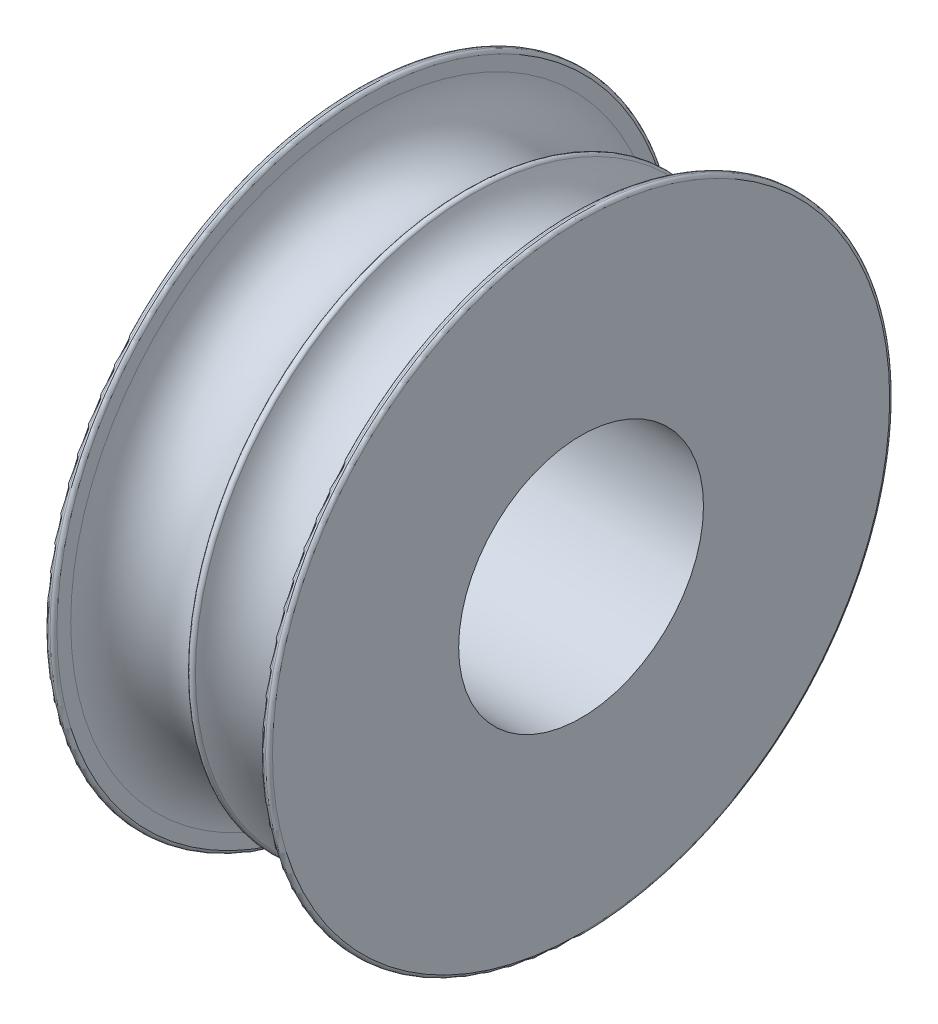
ISO-10303-21;
HEADER;
FILE_DESCRIPTION(('STEP AP214'),'2;1');
FILE_NAME('part.step','',(''),(''),'','','');
FILE_SCHEMA(('AUTOMOTIVE_DESIGN { 1 0 10303 214 1 1 1 1 }'));
ENDSEC;
DATA;
#1=APPLICATION_CONTEXT('core data for automotive mechanical design processes');
#2=APPLICATION_PROTOCOL_DEFINITION('international standard','automotive_design',2000,#1);
#3=PRODUCT_CONTEXT('',#1,'mechanical');
#4=PRODUCT('Part','Part','',(#3));
#5=PRODUCT_RELATED_PRODUCT_CATEGORY('part','',(#4));
#6=PRODUCT_DEFINITION_FORMATION('','',#4);
#7=PRODUCT_DEFINITION_CONTEXT('part definition',#1,'design');
#8=PRODUCT_DEFINITION('design','',#6,#7);
#9=PRODUCT_DEFINITION_SHAPE('','',#8);
#10=(LENGTH_UNIT() NAMED_UNIT(*) SI_UNIT(.MILLI.,.METRE.));
#11=(NAMED_UNIT(*) PLANE_ANGLE_UNIT() SI_UNIT($,.RADIAN.));
#12=(NAMED_UNIT(*) SI_UNIT($,.STERADIAN.) SOLID_ANGLE_UNIT());
#13=UNCERTAINTY_MEASURE_WITH_UNIT(LENGTH_MEASURE(1.E-05),#10,'distance_accuracy_value','');
#14=(GEOMETRIC_REPRESENTATION_CONTEXT(3) GLOBAL_UNCERTAINTY_ASSIGNED_CONTEXT((#13)) GLOBAL_UNIT_ASSIGNED_CONTEXT((#10,
#11,#12)) REPRESENTATION_CONTEXT('',''));
#15=CARTESIAN_POINT('',(0.,0.,0.));
#16=DIRECTION('',(0.,0.,1.));
#17=DIRECTION('',(1.,0.,0.));
#18=AXIS2_PLACEMENT_3D('',#15,#16,#17);
#19=CARTESIAN_POINT('',(0.,0.,0.));
#20=DIRECTION('',(-1.,0.,0.));
#21=DIRECTION('',(0.,0.,1.));
#22=AXIS2_PLACEMENT_3D('',#19,#20,#21);
#23=PLANE('',#22);
#24=CARTESIAN_POINT('',(0.,0.,0.));
#25=DIRECTION('',(-1.,0.,0.));
#26=DIRECTION('',(0.,0.,1.));
#27=AXIS2_PLACEMENT_3D('',#24,#25,#26);
#28=CIRCLE('',#27,17.9);
#29=CARTESIAN_POINT('',(0.,0.,17.9));
#30=VERTEX_POINT('',#29);
#31=EDGE_CURVE('E71',#30,#30,#28,.F.);
#32=ORIENTED_EDGE('',*,*,#31,.T.);
#33=EDGE_LOOP('',(#32));
#34=FACE_BOUND('',#33,.T.);
#35=CARTESIAN_POINT('',(0.,0.,0.));
#36=DIRECTION('',(-1.,0.,0.));
#37=DIRECTION('',(0.,0.,1.));
#38=AXIS2_PLACEMENT_3D('',#35,#36,#37);
#39=CIRCLE('',#38,7.1);
#40=CARTESIAN_POINT('',(0.,0.,7.1));
#41=VERTEX_POINT('',#40);
#42=EDGE_CURVE('E99',#41,#41,#39,.T.);
#43=ORIENTED_EDGE('',*,*,#42,.T.);
#44=EDGE_LOOP('',(#43));
#45=FACE_BOUND('',#44,.T.);
#46=ADVANCED_FACE('F43',(#34,#45),#23,.F.);
#47=CARTESIAN_POINT('',(-13.,0.,0.));
#48=DIRECTION('',(-1.,0.,0.));
#49=DIRECTION('',(0.,0.,1.));
#50=AXIS2_PLACEMENT_3D('',#47,#48,#49);
#51=CYLINDRICAL_SURFACE('',#50,18.1);
#52=CARTESIAN_POINT('',(-0.200000000000004,0.,0.));
#53=DIRECTION('',(-1.,0.,0.));
#54=DIRECTION('',(0.,0.,1.));
#55=AXIS2_PLACEMENT_3D('',#52,#53,#54);
#56=CIRCLE('',#55,18.1);
#57=CARTESIAN_POINT('',(-0.200000000000002,0.,18.1));
#58=VERTEX_POINT('',#57);
#59=EDGE_CURVE('E75',#58,#58,#56,.T.);
#60=ORIENTED_EDGE('',*,*,#59,.T.);
#61=EDGE_LOOP('',(#60));
#62=FACE_BOUND('',#61,.T.);
#63=CARTESIAN_POINT('',(-0.300000000000003,0.,0.));
#64=DIRECTION('',(1.,0.,0.));
#65=DIRECTION('',(0.,0.,-1.));
#66=AXIS2_PLACEMENT_3D('',#63,#64,#65);
#67=CIRCLE('',#66,18.1);
#68=CARTESIAN_POINT('',(-0.300000000000006,0.,-18.1));
#69=VERTEX_POINT('',#68);
#70=EDGE_CURVE('E79',#69,#69,#67,.T.);
#71=ORIENTED_EDGE('',*,*,#70,.T.);
#72=EDGE_LOOP('',(#71));
#73=FACE_BOUND('',#72,.T.);
#74=ADVANCED_FACE('F118',(#62,#73),#51,.T.);
#75=CARTESIAN_POINT('',(-0.500000000000004,0.,-18.1));
#76=DIRECTION('',(1.,0.,0.));
#77=DIRECTION('',(0.,0.,-1.));
#78=AXIS2_PLACEMENT_3D('',#75,#76,#77);
#79=PLANE('',#78);
#80=CARTESIAN_POINT('',(-0.500000000000002,0.,0.));
#81=DIRECTION('',(1.,0.,0.));
#82=DIRECTION('',(0.,0.,-1.));
#83=AXIS2_PLACEMENT_3D('',#80,#81,#82);
#84=CIRCLE('',#83,17.9);
#85=CARTESIAN_POINT('',(-0.500000000000004,0.,-17.9));
#86=VERTEX_POINT('',#85);
#87=EDGE_CURVE('E67',#86,#86,#84,.F.);
#88=ORIENTED_EDGE('',*,*,#87,.T.);
#89=EDGE_LOOP('',(#88));
#90=FACE_BOUND('',#89,.T.);
#91=CARTESIAN_POINT('',(-0.500000000000002,0.,0.));
#92=DIRECTION('',(-1.,0.,0.));
#93=DIRECTION('',(0.,0.,1.));
#94=AXIS2_PLACEMENT_3D('',#91,#92,#93);
#95=CIRCLE('',#94,17.1);
#96=CARTESIAN_POINT('',(-0.5,0.,17.1));
#97=VERTEX_POINT('',#96);
#98=EDGE_CURVE('E91',#97,#97,#95,.T.);
#99=ORIENTED_EDGE('',*,*,#98,.F.);
#100=EDGE_LOOP('',(#99));
#101=FACE_BOUND('',#100,.T.);
#102=ADVANCED_FACE('F124',(#90,#101),#79,.F.);
#103=CARTESIAN_POINT('',(-3.5,0.,0.));
#104=DIRECTION('',(-1.,0.,0.));
#105=DIRECTION('',(0.,0.,1.));
#106=AXIS2_PLACEMENT_3D('',#103,#104,#105);
#107=TOROIDAL_SURFACE('',#106,17.1,3.);
#108=CARTESIAN_POINT('',(-6.31250000000001,0.,0.));
#109=DIRECTION('',(1.,0.,0.));
#110=DIRECTION('',(0.,0.,-1.));
#111=AXIS2_PLACEMENT_3D('',#108,#109,#110);
#112=CIRCLE('',#111,16.0560441819694);
#113=CARTESIAN_POINT('',(-6.31250000000001,0.,-16.0560441819694));
#114=VERTEX_POINT('',#113);
#115=EDGE_CURVE('E83',#114,#114,#112,.T.);
#116=ORIENTED_EDGE('',*,*,#115,.T.);
#117=EDGE_LOOP('',(#116));
#118=FACE_BOUND('',#117,.T.);
#119=ORIENTED_EDGE('',*,*,#98,.T.);
#120=EDGE_LOOP('',(#119));
#121=FACE_BOUND('',#120,.T.);
#122=ADVANCED_FACE('F166',(#118,#121),#107,.F.);
#123=CARTESIAN_POINT('',(-9.5,0.,0.));
#124=DIRECTION('',(-1.,0.,0.));
#125=DIRECTION('',(0.,0.,1.));
#126=AXIS2_PLACEMENT_3D('',#123,#124,#125);
#127=TOROIDAL_SURFACE('',#126,17.1,3.);
#128=CARTESIAN_POINT('',(-6.68750000000012,0.,0.));
#129=DIRECTION('',(-1.,0.,0.));
#130=DIRECTION('',(0.,0.,1.));
#131=AXIS2_PLACEMENT_3D('',#128,#129,#130);
#132=CIRCLE('',#131,16.0560441819694);
#133=CARTESIAN_POINT('',(-6.68750000000012,0.,16.0560441819694));
#134=VERTEX_POINT('',#133);
#135=EDGE_CURVE('E87',#134,#134,#132,.T.);
#136=ORIENTED_EDGE('',*,*,#135,.T.);
#137=EDGE_LOOP('',(#136));
#138=FACE_BOUND('',#137,.T.);
#139=CARTESIAN_POINT('',(-12.5,0.,0.));
#140=DIRECTION('',(-1.,0.,0.));
#141=DIRECTION('',(0.,0.,1.));
#142=AXIS2_PLACEMENT_3D('',#139,#140,#141);
#143=CIRCLE('',#142,17.1);
#144=CARTESIAN_POINT('',(-12.5,0.,17.1));
#145=VERTEX_POINT('',#144);
#146=EDGE_CURVE('E95',#145,#145,#143,.T.);
#147=ORIENTED_EDGE('',*,*,#146,.F.);
#148=EDGE_LOOP('',(#147));
#149=FACE_BOUND('',#148,.T.);
#150=ADVANCED_FACE('F161',(#138,#149),#127,.F.);
#151=CARTESIAN_POINT('',(-12.5,0.,-18.1));
#152=DIRECTION('',(-1.,0.,0.));
#153=DIRECTION('',(0.,0.,1.));
#154=AXIS2_PLACEMENT_3D('',#151,#152,#153);
#155=PLANE('',#154);
#156=CARTESIAN_POINT('',(-12.5,0.,0.));
#157=DIRECTION('',(-1.,0.,0.));
#158=DIRECTION('',(0.,0.,1.));
#159=AXIS2_PLACEMENT_3D('',#156,#157,#158);
#160=CIRCLE('',#159,17.9);
#161=CARTESIAN_POINT('',(-12.5,0.,17.9));
#162=VERTEX_POINT('',#161);
#163=EDGE_CURVE('E51',#162,#162,#160,.F.);
#164=ORIENTED_EDGE('',*,*,#163,.T.);
#165=EDGE_LOOP('',(#164));
#166=FACE_BOUND('',#165,.T.);
#167=ORIENTED_EDGE('',*,*,#146,.T.);
#168=EDGE_LOOP('',(#167));
#169=FACE_BOUND('',#168,.T.);
#170=ADVANCED_FACE('F152',(#166,#169),#155,.F.);
#171=CARTESIAN_POINT('',(-13.,0.,0.));
#172=DIRECTION('',(-1.,0.,0.));
#173=DIRECTION('',(0.,0.,1.));
#174=AXIS2_PLACEMENT_3D('',#171,#172,#173);
#175=CYLINDRICAL_SURFACE('',#174,18.1);
#176=CARTESIAN_POINT('',(-12.7,0.,0.));
#177=DIRECTION('',(-1.,0.,0.));
#178=DIRECTION('',(0.,0.,1.));
#179=AXIS2_PLACEMENT_3D('',#176,#177,#178);
#180=CIRCLE('',#179,18.1);
#181=CARTESIAN_POINT('',(-12.7,0.,18.1));
#182=VERTEX_POINT('',#181);
#183=EDGE_CURVE('E56',#182,#182,#180,.T.);
#184=ORIENTED_EDGE('',*,*,#183,.T.);
#185=EDGE_LOOP('',(#184));
#186=FACE_BOUND('',#185,.T.);
#187=CARTESIAN_POINT('',(-12.8,0.,0.));
#188=DIRECTION('',(1.,0.,0.));
#189=DIRECTION('',(0.,0.,-1.));
#190=AXIS2_PLACEMENT_3D('',#187,#188,#189);
#191=CIRCLE('',#190,18.1);
#192=CARTESIAN_POINT('',(-12.8,0.,-18.1));
#193=VERTEX_POINT('',#192);
#194=EDGE_CURVE('E61',#193,#193,#191,.T.);
#195=ORIENTED_EDGE('',*,*,#194,.T.);
#196=EDGE_LOOP('',(#195));
#197=FACE_BOUND('',#196,.T.);
#198=ADVANCED_FACE('F149',(#186,#197),#175,.T.);
#199=CARTESIAN_POINT('',(-13.,0.,0.));
#200=DIRECTION('',(1.,0.,0.));
#201=DIRECTION('',(0.,0.,-1.));
#202=AXIS2_PLACEMENT_3D('',#199,#200,#201);
#203=PLANE('',#202);
#204=CARTESIAN_POINT('',(-13.,0.,0.));
#205=DIRECTION('',(1.,0.,0.));
#206=DIRECTION('',(0.,0.,-1.));
#207=AXIS2_PLACEMENT_3D('',#204,#205,#206);
#208=CIRCLE('',#207,17.9);
#209=CARTESIAN_POINT('',(-13.,0.,-17.9));
#210=VERTEX_POINT('',#209);
#211=EDGE_CURVE('E10',#210,#210,#208,.F.);
#212=ORIENTED_EDGE('',*,*,#211,.T.);
#213=EDGE_LOOP('',(#212));
#214=FACE_BOUND('',#213,.T.);
#215=CARTESIAN_POINT('',(-13.,0.,0.));
#216=DIRECTION('',(1.,0.,0.));
#217=DIRECTION('',(0.,0.,-1.));
#218=AXIS2_PLACEMENT_3D('',#215,#216,#217);
#219=CIRCLE('',#218,7.1);
#220=CARTESIAN_POINT('',(-13.,0.,-7.1));
#221=VERTEX_POINT('',#220);
#222=EDGE_CURVE('E103',#221,#221,#219,.T.);
#223=ORIENTED_EDGE('',*,*,#222,.T.);
#224=EDGE_LOOP('',(#223));
#225=FACE_BOUND('',#224,.T.);
#226=ADVANCED_FACE('F108',(#214,#225),#203,.F.);
#227=CARTESIAN_POINT('',(-13.,0.,0.));
#228=DIRECTION('',(1.,0.,0.));
#229=DIRECTION('',(0.,0.,-1.));
#230=AXIS2_PLACEMENT_3D('',#227,#228,#229);
#231=CYLINDRICAL_SURFACE('',#230,7.1);
#232=ORIENTED_EDGE('',*,*,#222,.F.);
#233=EDGE_LOOP('',(#232));
#234=FACE_BOUND('',#233,.T.);
#235=ORIENTED_EDGE('',*,*,#42,.F.);
#236=EDGE_LOOP('',(#235));
#237=FACE_BOUND('',#236,.T.);
#238=ADVANCED_FACE('F110',(#234,#237),#231,.F.);
#239=CARTESIAN_POINT('',(-6.5,0.,0.));
#240=DIRECTION('',(1.,0.,0.));
#241=DIRECTION('',(0.,0.,-1.));
#242=AXIS2_PLACEMENT_3D('',#239,#240,#241);
#243=TOROIDAL_SURFACE('',#242,15.986447127434,0.2);
#244=ORIENTED_EDGE('',*,*,#115,.F.);
#245=EDGE_LOOP('',(#244));
#246=FACE_BOUND('',#245,.T.);
#247=ORIENTED_EDGE('',*,*,#135,.F.);
#248=EDGE_LOOP('',(#247));
#249=FACE_BOUND('',#248,.T.);
#250=ADVANCED_FACE('F113',(#246,#249),#243,.T.);
#251=CARTESIAN_POINT('',(-0.200000000000004,0.,0.));
#252=DIRECTION('',(-1.,0.,0.));
#253=DIRECTION('',(0.,0.,1.));
#254=AXIS2_PLACEMENT_3D('',#251,#252,#253);
#255=TOROIDAL_SURFACE('',#254,17.9,0.2);
#256=ORIENTED_EDGE('',*,*,#31,.F.);
#257=EDGE_LOOP('',(#256));
#258=FACE_BOUND('',#257,.T.);
#259=ORIENTED_EDGE('',*,*,#59,.F.);
#260=EDGE_LOOP('',(#259));
#261=FACE_BOUND('',#260,.T.);
#262=ADVANCED_FACE('F131',(#258,#261),#255,.T.);
#263=CARTESIAN_POINT('',(-0.300000000000003,0.,0.));
#264=DIRECTION('',(1.,0.,0.));
#265=DIRECTION('',(0.,0.,-1.));
#266=AXIS2_PLACEMENT_3D('',#263,#264,#265);
#267=TOROIDAL_SURFACE('',#266,17.9,0.2);
#268=ORIENTED_EDGE('',*,*,#70,.F.);
#269=EDGE_LOOP('',(#268));
#270=FACE_BOUND('',#269,.T.);
#271=ORIENTED_EDGE('',*,*,#87,.F.);
#272=EDGE_LOOP('',(#271));
#273=FACE_BOUND('',#272,.T.);
#274=ADVANCED_FACE('F135',(#270,#273),#267,.T.);
#275=CARTESIAN_POINT('',(-12.7,0.,0.));
#276=DIRECTION('',(-1.,0.,0.));
#277=DIRECTION('',(0.,0.,1.));
#278=AXIS2_PLACEMENT_3D('',#275,#276,#277);
#279=TOROIDAL_SURFACE('',#278,17.9,0.2);
#280=ORIENTED_EDGE('',*,*,#163,.F.);
#281=EDGE_LOOP('',(#280));
#282=FACE_BOUND('',#281,.T.);
#283=ORIENTED_EDGE('',*,*,#183,.F.);
#284=EDGE_LOOP('',(#283));
#285=FACE_BOUND('',#284,.T.);
#286=ADVANCED_FACE('F138',(#282,#285),#279,.T.);
#287=CARTESIAN_POINT('',(-12.8,0.,0.));
#288=DIRECTION('',(1.,0.,0.));
#289=DIRECTION('',(0.,0.,-1.));
#290=AXIS2_PLACEMENT_3D('',#287,#288,#289);
#291=TOROIDAL_SURFACE('',#290,17.9,0.2);
#292=ORIENTED_EDGE('',*,*,#194,.F.);
#293=EDGE_LOOP('',(#292));
#294=FACE_BOUND('',#293,.T.);
#295=ORIENTED_EDGE('',*,*,#211,.F.);
#296=EDGE_LOOP('',(#295));
#297=FACE_BOUND('',#296,.T.);
#298=ADVANCED_FACE('F45',(#294,#297),#291,.T.);
#299=CLOSED_SHELL('',(#46,#74,#102,#122,#150,#170,#198,#226,#238,#250,#262,#274,#286,#298));
#300=MANIFOLD_SOLID_BREP('B2',#299);
#301=ADVANCED_BREP_SHAPE_REPRESENTATION('',(#18,#300),#14);
#302=SHAPE_DEFINITION_REPRESENTATION(#9,#301);
ENDSEC;
END-ISO-10303-21;
